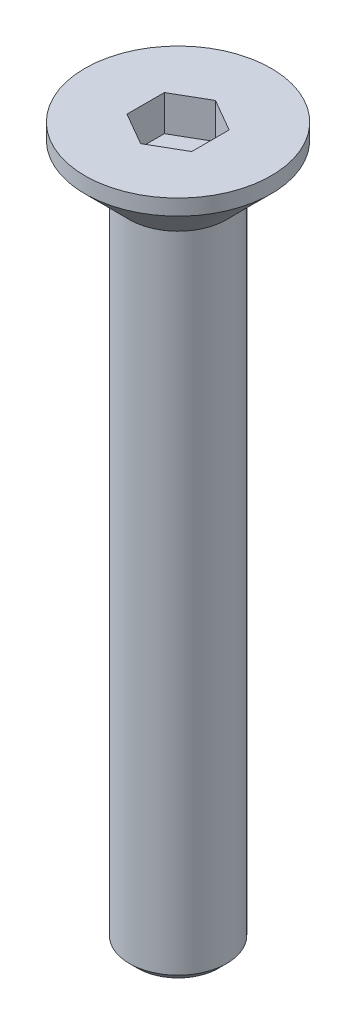
ISO-10303-21;
HEADER;
FILE_DESCRIPTION(('STEP AP214'),'2;1');
FILE_NAME('part.step','',(''),(''),'','','');
FILE_SCHEMA(('AUTOMOTIVE_DESIGN { 1 0 10303 214 1 1 1 1 }'));
ENDSEC;
DATA;
#1=APPLICATION_CONTEXT('core data for automotive mechanical design processes');
#2=APPLICATION_PROTOCOL_DEFINITION('international standard','automotive_design',2000,#1);
#3=PRODUCT_CONTEXT('',#1,'mechanical');
#4=PRODUCT('Part','Part','',(#3));
#5=PRODUCT_RELATED_PRODUCT_CATEGORY('part','',(#4));
#6=PRODUCT_DEFINITION_FORMATION('','',#4);
#7=PRODUCT_DEFINITION_CONTEXT('part definition',#1,'design');
#8=PRODUCT_DEFINITION('design','',#6,#7);
#9=PRODUCT_DEFINITION_SHAPE('','',#8);
#10=(LENGTH_UNIT() NAMED_UNIT(*) SI_UNIT(.MILLI.,.METRE.));
#11=(NAMED_UNIT(*) PLANE_ANGLE_UNIT() SI_UNIT($,.RADIAN.));
#12=(NAMED_UNIT(*) SI_UNIT($,.STERADIAN.) SOLID_ANGLE_UNIT());
#13=UNCERTAINTY_MEASURE_WITH_UNIT(LENGTH_MEASURE(1.E-05),#10,'distance_accuracy_value','');
#14=(GEOMETRIC_REPRESENTATION_CONTEXT(3) GLOBAL_UNCERTAINTY_ASSIGNED_CONTEXT((#13)) GLOBAL_UNIT_ASSIGNED_CONTEXT((#10,
#11,#12)) REPRESENTATION_CONTEXT('',''));
#15=CARTESIAN_POINT('',(0.,0.,0.));
#16=DIRECTION('',(0.,0.,1.));
#17=DIRECTION('',(1.,0.,0.));
#18=AXIS2_PLACEMENT_3D('',#15,#16,#17);
#19=CARTESIAN_POINT('',(0.,0.,0.));
#20=DIRECTION('',(0.,1.,0.));
#21=DIRECTION('',(-1.,0.,0.));
#22=AXIS2_PLACEMENT_3D('',#19,#20,#21);
#23=PLANE('',#22);
#24=DIRECTION('',(-0.866025403784438,0.,0.5));
#25=VECTOR('',#24,1.);
#26=CARTESIAN_POINT('',(0.,0.,-1.15470053837925));
#27=LINE('',#26,#25);
#28=CARTESIAN_POINT('',(0.,0.,-1.15470053837925));
#29=VERTEX_POINT('',#28);
#30=CARTESIAN_POINT('',(-1.,0.,-0.577350269189625));
#31=VERTEX_POINT('',#30);
#32=EDGE_CURVE('E49',#29,#31,#27,.T.);
#33=ORIENTED_EDGE('',*,*,#32,.F.);
#34=DIRECTION('',(-0.866025403784439,0.,-0.5));
#35=VECTOR('',#34,1.);
#36=CARTESIAN_POINT('',(1.,0.,-0.577350269189626));
#37=LINE('',#36,#35);
#38=CARTESIAN_POINT('',(1.,0.,-0.577350269189626));
#39=VERTEX_POINT('',#38);
#40=EDGE_CURVE('E132',#39,#29,#37,.T.);
#41=ORIENTED_EDGE('',*,*,#40,.F.);
#42=DIRECTION('',(0.,0.,-1.));
#43=VECTOR('',#42,1.);
#44=CARTESIAN_POINT('',(1.,0.,0.577350269189625));
#45=LINE('',#44,#43);
#46=CARTESIAN_POINT('',(1.,0.,0.577350269189625));
#47=VERTEX_POINT('',#46);
#48=EDGE_CURVE('E130',#47,#39,#45,.T.);
#49=ORIENTED_EDGE('',*,*,#48,.F.);
#50=DIRECTION('',(0.866025403784438,0.,-0.5));
#51=VECTOR('',#50,1.);
#52=CARTESIAN_POINT('',(0.,0.,1.15470053837925));
#53=LINE('',#52,#51);
#54=CARTESIAN_POINT('',(0.,0.,1.15470053837925));
#55=VERTEX_POINT('',#54);
#56=EDGE_CURVE('E97',#55,#47,#53,.T.);
#57=ORIENTED_EDGE('',*,*,#56,.F.);
#58=DIRECTION('',(0.866025403784439,0.,0.5));
#59=VECTOR('',#58,1.);
#60=CARTESIAN_POINT('',(-1.,0.,0.577350269189626));
#61=LINE('',#60,#59);
#62=CARTESIAN_POINT('',(-1.,0.,0.577350269189626));
#63=VERTEX_POINT('',#62);
#64=EDGE_CURVE('E126',#63,#55,#61,.T.);
#65=ORIENTED_EDGE('',*,*,#64,.F.);
#66=DIRECTION('',(0.,0.,1.));
#67=VECTOR('',#66,1.);
#68=CARTESIAN_POINT('',(-1.,0.,-0.577350269189625));
#69=LINE('',#68,#67);
#70=EDGE_CURVE('E123',#31,#63,#69,.T.);
#71=ORIENTED_EDGE('',*,*,#70,.F.);
#72=EDGE_LOOP('',(#33,#41,#49,#57,#65,#71));
#73=FACE_BOUND('',#72,.T.);
#74=CARTESIAN_POINT('',(0.,0.,0.));
#75=DIRECTION('',(0.,1.,0.));
#76=DIRECTION('',(-1.,0.,0.));
#77=AXIS2_PLACEMENT_3D('',#74,#75,#76);
#78=CIRCLE('',#77,2.875);
#79=CARTESIAN_POINT('',(-2.875,0.,0.));
#80=VERTEX_POINT('',#79);
#81=EDGE_CURVE('E11',#80,#80,#78,.T.);
#82=ORIENTED_EDGE('',*,*,#81,.T.);
#83=EDGE_LOOP('',(#82));
#84=FACE_BOUND('',#83,.T.);
#85=ADVANCED_FACE('F35',(#73,#84),#23,.T.);
#86=CARTESIAN_POINT('',(0.,0.,0.));
#87=DIRECTION('',(0.,1.,0.));
#88=DIRECTION('',(-1.,0.,0.));
#89=AXIS2_PLACEMENT_3D('',#86,#87,#88);
#90=CYLINDRICAL_SURFACE('',#89,2.875);
#91=CARTESIAN_POINT('',(0.,-0.485000000000006,0.));
#92=DIRECTION('',(0.,1.,0.));
#93=DIRECTION('',(-1.,0.,0.));
#94=AXIS2_PLACEMENT_3D('',#91,#92,#93);
#95=CIRCLE('',#94,2.875);
#96=CARTESIAN_POINT('',(-2.875,-0.485000000000006,0.));
#97=VERTEX_POINT('',#96);
#98=EDGE_CURVE('E42',#97,#97,#95,.T.);
#99=ORIENTED_EDGE('',*,*,#98,.T.);
#100=EDGE_LOOP('',(#99));
#101=FACE_BOUND('',#100,.T.);
#102=ORIENTED_EDGE('',*,*,#81,.F.);
#103=EDGE_LOOP('',(#102));
#104=FACE_BOUND('',#103,.T.);
#105=ADVANCED_FACE('F152',(#101,#104),#90,.T.);
#106=CARTESIAN_POINT('',(0.,-0.485000000000006,0.));
#107=DIRECTION('',(0.,1.,0.));
#108=DIRECTION('',(-1.,0.,0.));
#109=AXIS2_PLACEMENT_3D('',#106,#107,#108);
#110=CONICAL_SURFACE('',#109,2.875,0.78539816339745);
#111=CARTESIAN_POINT('',(0.,-1.86,0.));
#112=DIRECTION('',(0.,1.,0.));
#113=DIRECTION('',(-1.,0.,0.));
#114=AXIS2_PLACEMENT_3D('',#111,#112,#113);
#115=CIRCLE('',#114,1.5);
#116=CARTESIAN_POINT('',(-1.5,-1.86,0.));
#117=VERTEX_POINT('',#116);
#118=EDGE_CURVE('E147',#117,#117,#115,.T.);
#119=ORIENTED_EDGE('',*,*,#118,.T.);
#120=EDGE_LOOP('',(#119));
#121=FACE_BOUND('',#120,.T.);
#122=ORIENTED_EDGE('',*,*,#98,.F.);
#123=EDGE_LOOP('',(#122));
#124=FACE_BOUND('',#123,.T.);
#125=ADVANCED_FACE('F155',(#121,#124),#110,.T.);
#126=CARTESIAN_POINT('',(0.,0.,0.));
#127=DIRECTION('',(0.,1.,0.));
#128=DIRECTION('',(-1.,0.,0.));
#129=AXIS2_PLACEMENT_3D('',#126,#127,#128);
#130=CYLINDRICAL_SURFACE('',#129,1.5);
#131=CARTESIAN_POINT('',(0.,-21.75,0.));
#132=DIRECTION('',(0.,1.,0.));
#133=DIRECTION('',(-1.,0.,0.));
#134=AXIS2_PLACEMENT_3D('',#131,#132,#133);
#135=CIRCLE('',#134,1.5);
#136=CARTESIAN_POINT('',(-1.5,-21.75,0.));
#137=VERTEX_POINT('',#136);
#138=EDGE_CURVE('E144',#137,#137,#135,.T.);
#139=ORIENTED_EDGE('',*,*,#138,.T.);
#140=EDGE_LOOP('',(#139));
#141=FACE_BOUND('',#140,.T.);
#142=ORIENTED_EDGE('',*,*,#118,.F.);
#143=EDGE_LOOP('',(#142));
#144=FACE_BOUND('',#143,.T.);
#145=ADVANCED_FACE('F157',(#141,#144),#130,.T.);
#146=CARTESIAN_POINT('',(0.,-21.75,0.));
#147=DIRECTION('',(0.,1.,0.));
#148=DIRECTION('',(-1.,0.,0.));
#149=AXIS2_PLACEMENT_3D('',#146,#147,#148);
#150=CONICAL_SURFACE('',#149,1.5,0.785398163397448);
#151=CARTESIAN_POINT('',(0.,-22.,0.));
#152=DIRECTION('',(0.,1.,0.));
#153=DIRECTION('',(-1.,0.,0.));
#154=AXIS2_PLACEMENT_3D('',#151,#152,#153);
#155=CIRCLE('',#154,1.25);
#156=CARTESIAN_POINT('',(-1.25,-22.,0.));
#157=VERTEX_POINT('',#156);
#158=EDGE_CURVE('E136',#157,#157,#155,.T.);
#159=ORIENTED_EDGE('',*,*,#158,.T.);
#160=EDGE_LOOP('',(#159));
#161=FACE_BOUND('',#160,.T.);
#162=ORIENTED_EDGE('',*,*,#138,.F.);
#163=EDGE_LOOP('',(#162));
#164=FACE_BOUND('',#163,.T.);
#165=ADVANCED_FACE('F164',(#161,#164),#150,.T.);
#166=CARTESIAN_POINT('',(-1.25,-22.,0.));
#167=DIRECTION('',(0.,-1.,0.));
#168=DIRECTION('',(1.,0.,0.));
#169=AXIS2_PLACEMENT_3D('',#166,#167,#168);
#170=PLANE('',#169);
#171=ORIENTED_EDGE('',*,*,#158,.F.);
#172=EDGE_LOOP('',(#171));
#173=FACE_BOUND('',#172,.T.);
#174=ADVANCED_FACE('F182',(#173),#170,.T.);
#175=CARTESIAN_POINT('',(0.,-1.1,-1.15470053837925));
#176=DIRECTION('',(-0.5,0.,-0.866025403784438));
#177=DIRECTION('',(-0.866025403784438,0.,0.5));
#178=AXIS2_PLACEMENT_3D('',#175,#176,#177);
#179=PLANE('',#178);
#180=ORIENTED_EDGE('',*,*,#32,.T.);
#181=DIRECTION('',(0.,1.,0.));
#182=VECTOR('',#181,1.);
#183=CARTESIAN_POINT('',(-1.,-1.1,-0.577350269189625));
#184=LINE('',#183,#182);
#185=CARTESIAN_POINT('',(-1.,-1.1,-0.577350269189625));
#186=VERTEX_POINT('',#185);
#187=EDGE_CURVE('E79',#186,#31,#184,.T.);
#188=ORIENTED_EDGE('',*,*,#187,.F.);
#189=DIRECTION('',(-0.866025403784438,0.,0.5));
#190=VECTOR('',#189,1.);
#191=CARTESIAN_POINT('',(0.,-1.1,-1.15470053837925));
#192=LINE('',#191,#190);
#193=CARTESIAN_POINT('',(0.,-1.1,-1.15470053837925));
#194=VERTEX_POINT('',#193);
#195=EDGE_CURVE('E134',#194,#186,#192,.T.);
#196=ORIENTED_EDGE('',*,*,#195,.F.);
#197=DIRECTION('',(0.,1.,0.));
#198=VECTOR('',#197,1.);
#199=CARTESIAN_POINT('',(0.,-1.1,-1.15470053837925));
#200=LINE('',#199,#198);
#201=EDGE_CURVE('E57',#194,#29,#200,.T.);
#202=ORIENTED_EDGE('',*,*,#201,.T.);
#203=EDGE_LOOP('',(#180,#188,#196,#202));
#204=FACE_BOUND('',#203,.T.);
#205=ADVANCED_FACE('F179',(#204),#179,.F.);
#206=CARTESIAN_POINT('',(1.,-1.1,-0.577350269189626));
#207=DIRECTION('',(0.5,0.,-0.866025403784439));
#208=DIRECTION('',(-0.866025403784439,0.,-0.5));
#209=AXIS2_PLACEMENT_3D('',#206,#207,#208);
#210=PLANE('',#209);
#211=ORIENTED_EDGE('',*,*,#40,.T.);
#212=ORIENTED_EDGE('',*,*,#201,.F.);
#213=DIRECTION('',(-0.866025403784439,0.,-0.5));
#214=VECTOR('',#213,1.);
#215=CARTESIAN_POINT('',(1.,-1.1,-0.577350269189626));
#216=LINE('',#215,#214);
#217=CARTESIAN_POINT('',(1.,-1.1,-0.577350269189626));
#218=VERTEX_POINT('',#217);
#219=EDGE_CURVE('E109',#218,#194,#216,.T.);
#220=ORIENTED_EDGE('',*,*,#219,.F.);
#221=DIRECTION('',(0.,1.,0.));
#222=VECTOR('',#221,1.);
#223=CARTESIAN_POINT('',(1.,-1.1,-0.577350269189626));
#224=LINE('',#223,#222);
#225=EDGE_CURVE('E101',#218,#39,#224,.T.);
#226=ORIENTED_EDGE('',*,*,#225,.T.);
#227=EDGE_LOOP('',(#211,#212,#220,#226));
#228=FACE_BOUND('',#227,.T.);
#229=ADVANCED_FACE('F181',(#228),#210,.F.);
#230=CARTESIAN_POINT('',(1.,-1.1,0.577350269189625));
#231=DIRECTION('',(1.,0.,0.));
#232=DIRECTION('',(0.,0.,-1.));
#233=AXIS2_PLACEMENT_3D('',#230,#231,#232);
#234=PLANE('',#233);
#235=ORIENTED_EDGE('',*,*,#48,.T.);
#236=ORIENTED_EDGE('',*,*,#225,.F.);
#237=DIRECTION('',(0.,0.,-1.));
#238=VECTOR('',#237,1.);
#239=CARTESIAN_POINT('',(1.,-1.1,0.577350269189625));
#240=LINE('',#239,#238);
#241=CARTESIAN_POINT('',(1.,-1.1,0.577350269189625));
#242=VERTEX_POINT('',#241);
#243=EDGE_CURVE('E105',#242,#218,#240,.T.);
#244=ORIENTED_EDGE('',*,*,#243,.F.);
#245=DIRECTION('',(0.,1.,0.));
#246=VECTOR('',#245,1.);
#247=CARTESIAN_POINT('',(1.,-1.1,0.577350269189625));
#248=LINE('',#247,#246);
#249=EDGE_CURVE('E90',#242,#47,#248,.T.);
#250=ORIENTED_EDGE('',*,*,#249,.T.);
#251=EDGE_LOOP('',(#235,#236,#244,#250));
#252=FACE_BOUND('',#251,.T.);
#253=ADVANCED_FACE('F106',(#252),#234,.F.);
#254=CARTESIAN_POINT('',(0.,-1.1,1.15470053837925));
#255=DIRECTION('',(0.5,0.,0.866025403784438));
#256=DIRECTION('',(0.866025403784438,0.,-0.5));
#257=AXIS2_PLACEMENT_3D('',#254,#255,#256);
#258=PLANE('',#257);
#259=ORIENTED_EDGE('',*,*,#56,.T.);
#260=ORIENTED_EDGE('',*,*,#249,.F.);
#261=DIRECTION('',(0.866025403784438,0.,-0.5));
#262=VECTOR('',#261,1.);
#263=CARTESIAN_POINT('',(0.,-1.1,1.15470053837925));
#264=LINE('',#263,#262);
#265=CARTESIAN_POINT('',(0.,-1.1,1.15470053837925));
#266=VERTEX_POINT('',#265);
#267=EDGE_CURVE('E94',#266,#242,#264,.T.);
#268=ORIENTED_EDGE('',*,*,#267,.F.);
#269=DIRECTION('',(0.,1.,0.));
#270=VECTOR('',#269,1.);
#271=CARTESIAN_POINT('',(0.,-1.1,1.15470053837925));
#272=LINE('',#271,#270);
#273=EDGE_CURVE('E102',#266,#55,#272,.T.);
#274=ORIENTED_EDGE('',*,*,#273,.T.);
#275=EDGE_LOOP('',(#259,#260,#268,#274));
#276=FACE_BOUND('',#275,.T.);
#277=ADVANCED_FACE('F92',(#276),#258,.F.);
#278=CARTESIAN_POINT('',(-1.,-1.1,0.577350269189626));
#279=DIRECTION('',(-0.5,0.,0.866025403784438));
#280=DIRECTION('',(0.866025403784439,0.,0.5));
#281=AXIS2_PLACEMENT_3D('',#278,#279,#280);
#282=PLANE('',#281);
#283=ORIENTED_EDGE('',*,*,#64,.T.);
#284=ORIENTED_EDGE('',*,*,#273,.F.);
#285=DIRECTION('',(0.866025403784439,0.,0.5));
#286=VECTOR('',#285,1.);
#287=CARTESIAN_POINT('',(-1.,-1.1,0.577350269189626));
#288=LINE('',#287,#286);
#289=CARTESIAN_POINT('',(-1.,-1.1,0.577350269189626));
#290=VERTEX_POINT('',#289);
#291=EDGE_CURVE('E115',#290,#266,#288,.T.);
#292=ORIENTED_EDGE('',*,*,#291,.F.);
#293=DIRECTION('',(0.,1.,0.));
#294=VECTOR('',#293,1.);
#295=CARTESIAN_POINT('',(-1.,-1.1,0.577350269189626));
#296=LINE('',#295,#294);
#297=EDGE_CURVE('E139',#290,#63,#296,.T.);
#298=ORIENTED_EDGE('',*,*,#297,.T.);
#299=EDGE_LOOP('',(#283,#284,#292,#298));
#300=FACE_BOUND('',#299,.T.);
#301=ADVANCED_FACE('F241',(#300),#282,.F.);
#302=CARTESIAN_POINT('',(-1.,-1.1,-0.577350269189625));
#303=DIRECTION('',(-1.,0.,0.));
#304=DIRECTION('',(0.,-1.,0.));
#305=AXIS2_PLACEMENT_3D('',#302,#303,#304);
#306=PLANE('',#305);
#307=ORIENTED_EDGE('',*,*,#70,.T.);
#308=ORIENTED_EDGE('',*,*,#297,.F.);
#309=DIRECTION('',(0.,0.,1.));
#310=VECTOR('',#309,1.);
#311=CARTESIAN_POINT('',(-1.,-1.1,-0.577350269189625));
#312=LINE('',#311,#310);
#313=EDGE_CURVE('E117',#186,#290,#312,.T.);
#314=ORIENTED_EDGE('',*,*,#313,.F.);
#315=ORIENTED_EDGE('',*,*,#187,.T.);
#316=EDGE_LOOP('',(#307,#308,#314,#315));
#317=FACE_BOUND('',#316,.T.);
#318=ADVANCED_FACE('F177',(#317),#306,.F.);
#319=CARTESIAN_POINT('',(0.,-1.1,0.));
#320=DIRECTION('',(0.,1.,0.));
#321=DIRECTION('',(-1.,0.,0.));
#322=AXIS2_PLACEMENT_3D('',#319,#320,#321);
#323=PLANE('',#322);
#324=ORIENTED_EDGE('',*,*,#195,.T.);
#325=ORIENTED_EDGE('',*,*,#313,.T.);
#326=ORIENTED_EDGE('',*,*,#291,.T.);
#327=ORIENTED_EDGE('',*,*,#267,.T.);
#328=ORIENTED_EDGE('',*,*,#243,.T.);
#329=ORIENTED_EDGE('',*,*,#219,.T.);
#330=EDGE_LOOP('',(#324,#325,#326,#327,#328,#329));
#331=FACE_BOUND('',#330,.T.);
#332=ADVANCED_FACE('F112',(#331),#323,.T.);
#333=CLOSED_SHELL('',(#85,#105,#125,#145,#165,#174,#205,#229,#253,#277,#301,#318,#332));
#334=MANIFOLD_SOLID_BREP('B2',#333);
#335=ADVANCED_BREP_SHAPE_REPRESENTATION('',(#18,#334),#14);
#336=SHAPE_DEFINITION_REPRESENTATION(#9,#335);
ENDSEC;
END-ISO-10303-21;
